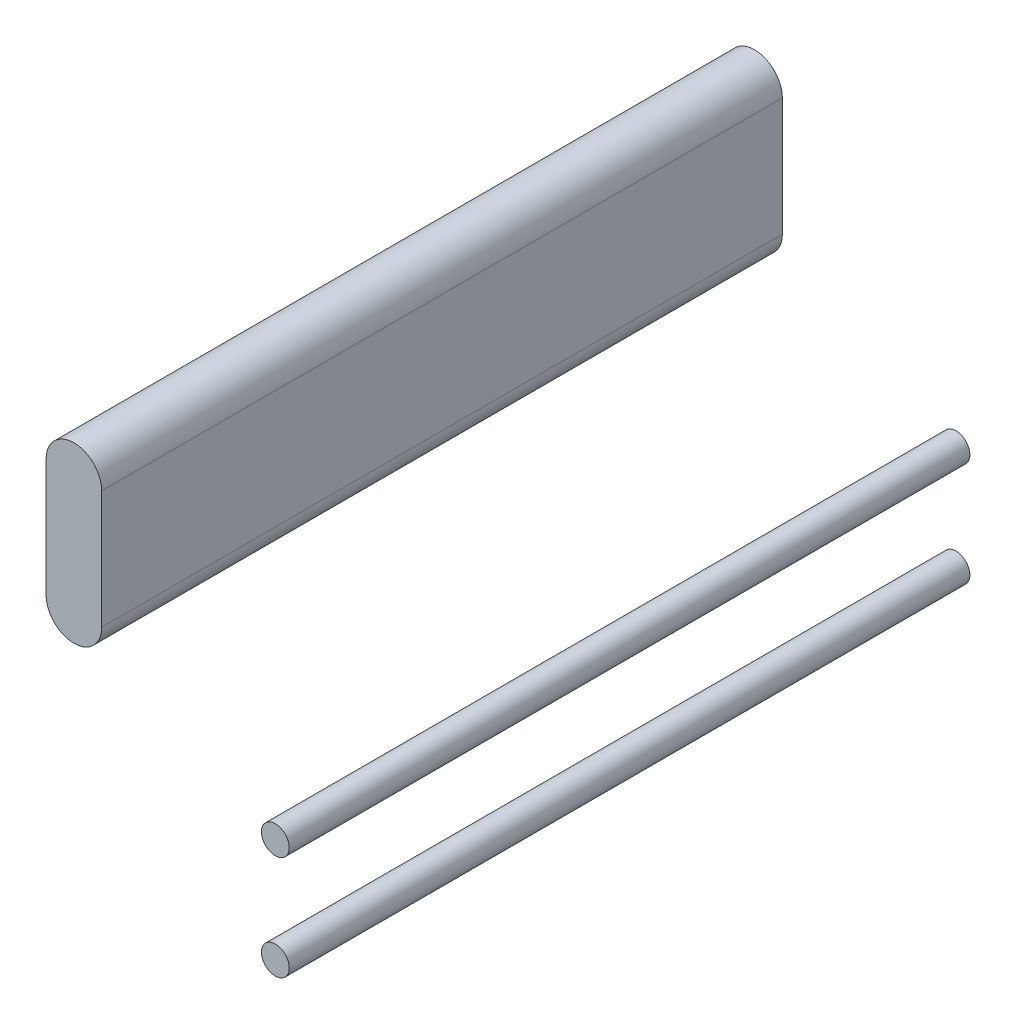
ISO-10303-21;
HEADER;
FILE_DESCRIPTION(('STEP AP214'),'2;1');
FILE_NAME('part.step','',(''),(''),'','','');
FILE_SCHEMA(('AUTOMOTIVE_DESIGN { 1 0 10303 214 1 1 1 1 }'));
ENDSEC;
DATA;
#1=APPLICATION_CONTEXT('core data for automotive mechanical design processes');
#2=APPLICATION_PROTOCOL_DEFINITION('international standard','automotive_design',2000,#1);
#3=PRODUCT_CONTEXT('',#1,'mechanical');
#4=PRODUCT('Part','Part','',(#3));
#5=PRODUCT_RELATED_PRODUCT_CATEGORY('part','',(#4));
#6=PRODUCT_DEFINITION_FORMATION('','',#4);
#7=PRODUCT_DEFINITION_CONTEXT('part definition',#1,'design');
#8=PRODUCT_DEFINITION('design','',#6,#7);
#9=PRODUCT_DEFINITION_SHAPE('','',#8);
#10=(LENGTH_UNIT() NAMED_UNIT(*) SI_UNIT(.MILLI.,.METRE.));
#11=(NAMED_UNIT(*) PLANE_ANGLE_UNIT() SI_UNIT($,.RADIAN.));
#12=(NAMED_UNIT(*) SI_UNIT($,.STERADIAN.) SOLID_ANGLE_UNIT());
#13=UNCERTAINTY_MEASURE_WITH_UNIT(LENGTH_MEASURE(1.E-05),#10,'distance_accuracy_value','');
#14=(GEOMETRIC_REPRESENTATION_CONTEXT(3) GLOBAL_UNCERTAINTY_ASSIGNED_CONTEXT((#13)) GLOBAL_UNIT_ASSIGNED_CONTEXT((#10,
#11,#12)) REPRESENTATION_CONTEXT('',''));
#15=CARTESIAN_POINT('',(0.,0.,0.));
#16=DIRECTION('',(0.,0.,1.));
#17=DIRECTION('',(1.,0.,0.));
#18=AXIS2_PLACEMENT_3D('',#15,#16,#17);
#19=CARTESIAN_POINT('',(29.,-24.,98.));
#20=DIRECTION('',(0.,0.,-1.));
#21=DIRECTION('',(-1.,0.,0.));
#22=AXIS2_PLACEMENT_3D('',#19,#20,#21);
#23=CYLINDRICAL_SURFACE('',#22,2.00000000000001);
#24=CARTESIAN_POINT('',(29.,-24.,98.));
#25=DIRECTION('',(0.,0.,1.));
#26=DIRECTION('',(1.,0.,0.));
#27=AXIS2_PLACEMENT_3D('',#24,#25,#26);
#28=CIRCLE('',#27,2.00000000000001);
#29=CARTESIAN_POINT('',(31.,-24.,98.));
#30=VERTEX_POINT('',#29);
#31=EDGE_CURVE('E48',#30,#30,#28,.T.);
#32=ORIENTED_EDGE('',*,*,#31,.F.);
#33=EDGE_LOOP('',(#32));
#34=FACE_BOUND('',#33,.T.);
#35=CARTESIAN_POINT('',(29.,-24.,0.));
#36=DIRECTION('',(0.,0.,1.));
#37=DIRECTION('',(1.,0.,0.));
#38=AXIS2_PLACEMENT_3D('',#35,#36,#37);
#39=CIRCLE('',#38,2.00000000000001);
#40=CARTESIAN_POINT('',(31.,-24.,0.));
#41=VERTEX_POINT('',#40);
#42=EDGE_CURVE('E11',#41,#41,#39,.T.);
#43=ORIENTED_EDGE('',*,*,#42,.T.);
#44=EDGE_LOOP('',(#43));
#45=FACE_BOUND('',#44,.T.);
#46=ADVANCED_FACE('F44',(#34,#45),#23,.T.);
#47=CARTESIAN_POINT('',(29.,-24.,98.));
#48=DIRECTION('',(0.,0.,1.));
#49=DIRECTION('',(1.,0.,0.));
#50=AXIS2_PLACEMENT_3D('',#47,#48,#49);
#51=PLANE('',#50);
#52=ORIENTED_EDGE('',*,*,#31,.T.);
#53=EDGE_LOOP('',(#52));
#54=FACE_BOUND('',#53,.T.);
#55=ADVANCED_FACE('F46',(#54),#51,.T.);
#56=CARTESIAN_POINT('',(29.,-24.,0.));
#57=DIRECTION('',(0.,0.,1.));
#58=DIRECTION('',(1.,0.,0.));
#59=AXIS2_PLACEMENT_3D('',#56,#57,#58);
#60=PLANE('',#59);
#61=ORIENTED_EDGE('',*,*,#42,.F.);
#62=EDGE_LOOP('',(#61));
#63=FACE_BOUND('',#62,.T.);
#64=ADVANCED_FACE('F63',(#63),#60,.F.);
#65=CLOSED_SHELL('',(#46,#55,#64));
#66=MANIFOLD_SOLID_BREP('B2',#65);
#67=CARTESIAN_POINT('',(29.,-8.99999999999998,98.));
#68=DIRECTION('',(0.,0.,-1.));
#69=DIRECTION('',(-1.,0.,0.));
#70=AXIS2_PLACEMENT_3D('',#67,#68,#69);
#71=CYLINDRICAL_SURFACE('',#70,2.);
#72=CARTESIAN_POINT('',(29.,-8.99999999999998,98.));
#73=DIRECTION('',(0.,0.,1.));
#74=DIRECTION('',(1.,0.,0.));
#75=AXIS2_PLACEMENT_3D('',#72,#73,#74);
#76=CIRCLE('',#75,2.);
#77=CARTESIAN_POINT('',(31.,-8.99999999999998,98.));
#78=VERTEX_POINT('',#77);
#79=EDGE_CURVE('E104',#78,#78,#76,.T.);
#80=ORIENTED_EDGE('',*,*,#79,.F.);
#81=EDGE_LOOP('',(#80));
#82=FACE_BOUND('',#81,.T.);
#83=CARTESIAN_POINT('',(29.,-8.99999999999998,0.));
#84=DIRECTION('',(0.,0.,1.));
#85=DIRECTION('',(1.,0.,0.));
#86=AXIS2_PLACEMENT_3D('',#83,#84,#85);
#87=CIRCLE('',#86,2.);
#88=CARTESIAN_POINT('',(31.,-8.99999999999998,0.));
#89=VERTEX_POINT('',#88);
#90=EDGE_CURVE('E43',#89,#89,#87,.T.);
#91=ORIENTED_EDGE('',*,*,#90,.T.);
#92=EDGE_LOOP('',(#91));
#93=FACE_BOUND('',#92,.T.);
#94=ADVANCED_FACE('F100',(#82,#93),#71,.T.);
#95=CARTESIAN_POINT('',(29.,-8.99999999999998,98.));
#96=DIRECTION('',(0.,0.,1.));
#97=DIRECTION('',(1.,0.,0.));
#98=AXIS2_PLACEMENT_3D('',#95,#96,#97);
#99=PLANE('',#98);
#100=ORIENTED_EDGE('',*,*,#79,.T.);
#101=EDGE_LOOP('',(#100));
#102=FACE_BOUND('',#101,.T.);
#103=ADVANCED_FACE('F102',(#102),#99,.T.);
#104=CARTESIAN_POINT('',(29.,-8.99999999999998,0.));
#105=DIRECTION('',(0.,0.,1.));
#106=DIRECTION('',(1.,0.,0.));
#107=AXIS2_PLACEMENT_3D('',#104,#105,#106);
#108=PLANE('',#107);
#109=ORIENTED_EDGE('',*,*,#90,.F.);
#110=EDGE_LOOP('',(#109));
#111=FACE_BOUND('',#110,.T.);
#112=ADVANCED_FACE('F119',(#111),#108,.F.);
#113=CLOSED_SHELL('',(#94,#103,#112));
#114=MANIFOLD_SOLID_BREP('B6',#113);
#115=CARTESIAN_POINT('',(0.,5.00000000000001,98.));
#116=DIRECTION('',(0.,0.,-1.));
#117=DIRECTION('',(-1.,0.,0.));
#118=AXIS2_PLACEMENT_3D('',#115,#116,#117);
#119=CYLINDRICAL_SURFACE('',#118,4.);
#120=CARTESIAN_POINT('',(0.,5.00000000000001,0.));
#121=DIRECTION('',(0.,0.,1.));
#122=DIRECTION('',(1.,0.,0.));
#123=AXIS2_PLACEMENT_3D('',#120,#121,#122);
#124=CIRCLE('',#123,4.);
#125=CARTESIAN_POINT('',(-4.,5.00000000000001,0.));
#126=VERTEX_POINT('',#125);
#127=CARTESIAN_POINT('',(4.,5.00000000000001,0.));
#128=VERTEX_POINT('',#127);
#129=EDGE_CURVE('E210',#126,#128,#124,.T.);
#130=ORIENTED_EDGE('',*,*,#129,.T.);
#131=DIRECTION('',(0.,0.,-1.));
#132=VECTOR('',#131,1.);
#133=CARTESIAN_POINT('',(4.,5.00000000000001,98.));
#134=LINE('',#133,#132);
#135=CARTESIAN_POINT('',(4.,5.00000000000001,98.));
#136=VERTEX_POINT('',#135);
#137=EDGE_CURVE('E98',#136,#128,#134,.T.);
#138=ORIENTED_EDGE('',*,*,#137,.F.);
#139=CARTESIAN_POINT('',(0.,5.00000000000001,98.));
#140=DIRECTION('',(0.,0.,1.));
#141=DIRECTION('',(1.,0.,0.));
#142=AXIS2_PLACEMENT_3D('',#139,#140,#141);
#143=CIRCLE('',#142,4.);
#144=CARTESIAN_POINT('',(-4.,5.00000000000001,98.));
#145=VERTEX_POINT('',#144);
#146=EDGE_CURVE('E198',#145,#136,#143,.T.);
#147=ORIENTED_EDGE('',*,*,#146,.F.);
#148=DIRECTION('',(0.,0.,-1.));
#149=VECTOR('',#148,1.);
#150=CARTESIAN_POINT('',(-4.,5.00000000000001,98.));
#151=LINE('',#150,#149);
#152=EDGE_CURVE('E206',#145,#126,#151,.T.);
#153=ORIENTED_EDGE('',*,*,#152,.T.);
#154=EDGE_LOOP('',(#130,#138,#147,#153));
#155=FACE_BOUND('',#154,.T.);
#156=ADVANCED_FACE('F147',(#155),#119,.T.);
#157=CARTESIAN_POINT('',(4.,5.00000000000001,98.));
#158=DIRECTION('',(-1.,0.,0.));
#159=DIRECTION('',(0.,-1.,0.));
#160=AXIS2_PLACEMENT_3D('',#157,#158,#159);
#161=PLANE('',#160);
#162=DIRECTION('',(0.,1.,0.));
#163=VECTOR('',#162,1.);
#164=CARTESIAN_POINT('',(4.,5.00000000000001,0.));
#165=LINE('',#164,#163);
#166=CARTESIAN_POINT('',(4.,22.,0.));
#167=VERTEX_POINT('',#166);
#168=EDGE_CURVE('E202',#128,#167,#165,.T.);
#169=ORIENTED_EDGE('',*,*,#168,.T.);
#170=DIRECTION('',(0.,0.,-1.));
#171=VECTOR('',#170,1.);
#172=CARTESIAN_POINT('',(4.,22.,98.));
#173=LINE('',#172,#171);
#174=CARTESIAN_POINT('',(4.,22.,98.));
#175=VERTEX_POINT('',#174);
#176=EDGE_CURVE('E155',#175,#167,#173,.T.);
#177=ORIENTED_EDGE('',*,*,#176,.F.);
#178=DIRECTION('',(0.,1.,0.));
#179=VECTOR('',#178,1.);
#180=CARTESIAN_POINT('',(4.,5.00000000000001,98.));
#181=LINE('',#180,#179);
#182=EDGE_CURVE('E193',#136,#175,#181,.T.);
#183=ORIENTED_EDGE('',*,*,#182,.F.);
#184=ORIENTED_EDGE('',*,*,#137,.T.);
#185=EDGE_LOOP('',(#169,#177,#183,#184));
#186=FACE_BOUND('',#185,.T.);
#187=ADVANCED_FACE('F201',(#186),#161,.F.);
#188=CARTESIAN_POINT('',(0.,22.,98.));
#189=DIRECTION('',(0.,0.,-1.));
#190=DIRECTION('',(-1.,0.,0.));
#191=AXIS2_PLACEMENT_3D('',#188,#189,#190);
#192=CYLINDRICAL_SURFACE('',#191,4.);
#193=CARTESIAN_POINT('',(0.,22.,0.));
#194=DIRECTION('',(0.,0.,1.));
#195=DIRECTION('',(1.,0.,0.));
#196=AXIS2_PLACEMENT_3D('',#193,#194,#195);
#197=CIRCLE('',#196,4.);
#198=CARTESIAN_POINT('',(-4.,22.,0.));
#199=VERTEX_POINT('',#198);
#200=EDGE_CURVE('E180',#167,#199,#197,.T.);
#201=ORIENTED_EDGE('',*,*,#200,.T.);
#202=DIRECTION('',(0.,0.,-1.));
#203=VECTOR('',#202,1.);
#204=CARTESIAN_POINT('',(-4.,22.,98.));
#205=LINE('',#204,#203);
#206=CARTESIAN_POINT('',(-4.,22.,98.));
#207=VERTEX_POINT('',#206);
#208=EDGE_CURVE('E203',#207,#199,#205,.T.);
#209=ORIENTED_EDGE('',*,*,#208,.F.);
#210=CARTESIAN_POINT('',(0.,22.,98.));
#211=DIRECTION('',(0.,0.,1.));
#212=DIRECTION('',(1.,0.,0.));
#213=AXIS2_PLACEMENT_3D('',#210,#211,#212);
#214=CIRCLE('',#213,4.);
#215=EDGE_CURVE('E196',#175,#207,#214,.T.);
#216=ORIENTED_EDGE('',*,*,#215,.F.);
#217=ORIENTED_EDGE('',*,*,#176,.T.);
#218=EDGE_LOOP('',(#201,#209,#216,#217));
#219=FACE_BOUND('',#218,.T.);
#220=ADVANCED_FACE('F204',(#219),#192,.T.);
#221=CARTESIAN_POINT('',(-4.,22.,98.));
#222=DIRECTION('',(1.,0.,0.));
#223=DIRECTION('',(0.,1.,0.));
#224=AXIS2_PLACEMENT_3D('',#221,#222,#223);
#225=PLANE('',#224);
#226=DIRECTION('',(0.,-1.,0.));
#227=VECTOR('',#226,1.);
#228=CARTESIAN_POINT('',(-4.,22.,0.));
#229=LINE('',#228,#227);
#230=EDGE_CURVE('E186',#199,#126,#229,.T.);
#231=ORIENTED_EDGE('',*,*,#230,.T.);
#232=ORIENTED_EDGE('',*,*,#152,.F.);
#233=DIRECTION('',(0.,-1.,0.));
#234=VECTOR('',#233,1.);
#235=CARTESIAN_POINT('',(-4.,22.,98.));
#236=LINE('',#235,#234);
#237=EDGE_CURVE('E163',#207,#145,#236,.T.);
#238=ORIENTED_EDGE('',*,*,#237,.F.);
#239=ORIENTED_EDGE('',*,*,#208,.T.);
#240=EDGE_LOOP('',(#231,#232,#238,#239));
#241=FACE_BOUND('',#240,.T.);
#242=ADVANCED_FACE('F217',(#241),#225,.F.);
#243=CARTESIAN_POINT('',(0.,5.00000000000001,98.));
#244=DIRECTION('',(0.,0.,1.));
#245=DIRECTION('',(1.,0.,0.));
#246=AXIS2_PLACEMENT_3D('',#243,#244,#245);
#247=PLANE('',#246);
#248=ORIENTED_EDGE('',*,*,#146,.T.);
#249=ORIENTED_EDGE('',*,*,#182,.T.);
#250=ORIENTED_EDGE('',*,*,#215,.T.);
#251=ORIENTED_EDGE('',*,*,#237,.T.);
#252=EDGE_LOOP('',(#248,#249,#250,#251));
#253=FACE_BOUND('',#252,.T.);
#254=ADVANCED_FACE('F194',(#253),#247,.T.);
#255=CARTESIAN_POINT('',(0.,5.00000000000001,0.));
#256=DIRECTION('',(0.,0.,1.));
#257=DIRECTION('',(1.,0.,0.));
#258=AXIS2_PLACEMENT_3D('',#255,#256,#257);
#259=PLANE('',#258);
#260=ORIENTED_EDGE('',*,*,#129,.F.);
#261=ORIENTED_EDGE('',*,*,#230,.F.);
#262=ORIENTED_EDGE('',*,*,#200,.F.);
#263=ORIENTED_EDGE('',*,*,#168,.F.);
#264=EDGE_LOOP('',(#260,#261,#262,#263));
#265=FACE_BOUND('',#264,.T.);
#266=ADVANCED_FACE('F220',(#265),#259,.F.);
#267=CLOSED_SHELL('',(#156,#187,#220,#242,#254,#266));
#268=MANIFOLD_SOLID_BREP('B38',#267);
#269=ADVANCED_BREP_SHAPE_REPRESENTATION('',(#18,#66,#114,#268),#14);
#270=SHAPE_DEFINITION_REPRESENTATION(#9,#269);
ENDSEC;
END-ISO-10303-21;
